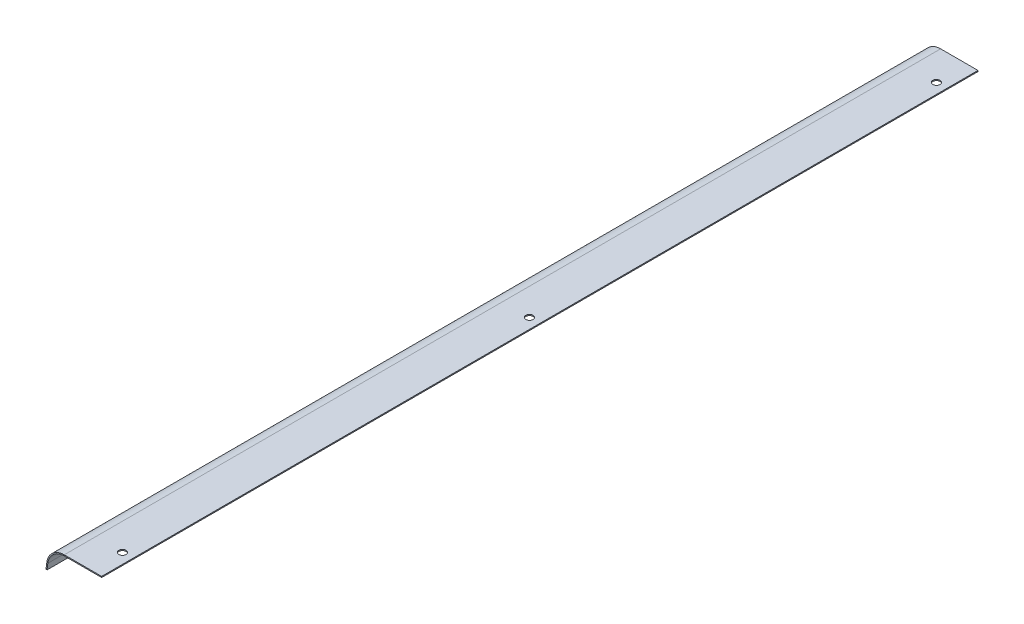
ISO-10303-21;
HEADER;
FILE_DESCRIPTION(('STEP AP214'),'2;1');
FILE_NAME('part.step','',(''),(''),'','','');
FILE_SCHEMA(('AUTOMOTIVE_DESIGN { 1 0 10303 214 1 1 1 1 }'));
ENDSEC;
DATA;
#1=APPLICATION_CONTEXT('core data for automotive mechanical design processes');
#2=APPLICATION_PROTOCOL_DEFINITION('international standard','automotive_design',2000,#1);
#3=PRODUCT_CONTEXT('',#1,'mechanical');
#4=PRODUCT('Part','Part','',(#3));
#5=PRODUCT_RELATED_PRODUCT_CATEGORY('part','',(#4));
#6=PRODUCT_DEFINITION_FORMATION('','',#4);
#7=PRODUCT_DEFINITION_CONTEXT('part definition',#1,'design');
#8=PRODUCT_DEFINITION('design','',#6,#7);
#9=PRODUCT_DEFINITION_SHAPE('','',#8);
#10=(LENGTH_UNIT() NAMED_UNIT(*) SI_UNIT(.MILLI.,.METRE.));
#11=(NAMED_UNIT(*) PLANE_ANGLE_UNIT() SI_UNIT($,.RADIAN.));
#12=(NAMED_UNIT(*) SI_UNIT($,.STERADIAN.) SOLID_ANGLE_UNIT());
#13=UNCERTAINTY_MEASURE_WITH_UNIT(LENGTH_MEASURE(1.E-05),#10,'distance_accuracy_value','');
#14=(GEOMETRIC_REPRESENTATION_CONTEXT(3) GLOBAL_UNCERTAINTY_ASSIGNED_CONTEXT((#13)) GLOBAL_UNIT_ASSIGNED_CONTEXT((#10,
#11,#12)) REPRESENTATION_CONTEXT('',''));
#15=CARTESIAN_POINT('',(0.,0.,0.));
#16=DIRECTION('',(0.,0.,1.));
#17=DIRECTION('',(1.,0.,0.));
#18=AXIS2_PLACEMENT_3D('',#15,#16,#17);
#19=CARTESIAN_POINT('',(-25.9372539331938,-7.,211.));
#20=DIRECTION('',(0.,0.,1.));
#21=DIRECTION('',(1.,0.,0.));
#22=AXIS2_PLACEMENT_3D('',#19,#20,#21);
#23=PLANE('',#22);
#24=DIRECTION('',(-0.992156741649222,0.124999999999998,0.));
#25=VECTOR('',#24,1.);
#26=CARTESIAN_POINT('',(-25.9372539331938,-7.,211.));
#27=LINE('',#26,#25);
#28=CARTESIAN_POINT('',(-25.9372539331938,-7.,211.));
#29=VERTEX_POINT('',#28);
#30=CARTESIAN_POINT('',(-26.4333323040184,-6.93750000000001,211.));
#31=VERTEX_POINT('',#30);
#32=EDGE_CURVE('E11',#29,#31,#27,.T.);
#33=ORIENTED_EDGE('',*,*,#32,.F.);
#34=CARTESIAN_POINT('',(-18.,-8.,211.));
#35=DIRECTION('',(0.,0.,1.));
#36=DIRECTION('',(1.,0.,0.));
#37=AXIS2_PLACEMENT_3D('',#34,#35,#36);
#38=CIRCLE('',#37,8.);
#39=CARTESIAN_POINT('',(-18.,0.,211.));
#40=VERTEX_POINT('',#39);
#41=EDGE_CURVE('E135',#40,#29,#38,.T.);
#42=ORIENTED_EDGE('',*,*,#41,.F.);
#43=DIRECTION('',(0.,-1.,0.));
#44=VECTOR('',#43,1.);
#45=CARTESIAN_POINT('',(-18.,0.499999999999999,211.));
#46=LINE('',#45,#44);
#47=CARTESIAN_POINT('',(-18.,0.499999999999999,211.));
#48=VERTEX_POINT('',#47);
#49=EDGE_CURVE('E46',#48,#40,#46,.T.);
#50=ORIENTED_EDGE('',*,*,#49,.F.);
#51=CARTESIAN_POINT('',(-18.,-8.,211.));
#52=DIRECTION('',(0.,0.,1.));
#53=DIRECTION('',(1.,0.,0.));
#54=AXIS2_PLACEMENT_3D('',#51,#52,#53);
#55=CIRCLE('',#54,8.5);
#56=EDGE_CURVE('E128',#48,#31,#55,.T.);
#57=ORIENTED_EDGE('',*,*,#56,.T.);
#58=EDGE_LOOP('',(#33,#42,#50,#57));
#59=FACE_BOUND('',#58,.T.);
#60=ADVANCED_FACE('F38',(#59),#23,.T.);
#61=CARTESIAN_POINT('',(-18.,0.499999999999999,211.));
#62=DIRECTION('',(0.,0.,1.));
#63=DIRECTION('',(1.,0.,0.));
#64=AXIS2_PLACEMENT_3D('',#61,#62,#63);
#65=PLANE('',#64);
#66=DIRECTION('',(-0.124999999999999,-0.992156741649222,0.));
#67=VECTOR('',#66,1.);
#68=CARTESIAN_POINT('',(-25.9372539331938,-7.,211.));
#69=LINE('',#68,#67);
#70=CARTESIAN_POINT('',(-26.3122539331938,-9.97647022494767,211.));
#71=VERTEX_POINT('',#70);
#72=EDGE_CURVE('E185',#29,#71,#69,.T.);
#73=ORIENTED_EDGE('',*,*,#72,.F.);
#74=ORIENTED_EDGE('',*,*,#32,.T.);
#75=DIRECTION('',(-0.124999999999999,-0.992156741649222,0.));
#76=VECTOR('',#75,1.);
#77=CARTESIAN_POINT('',(-26.4333323040184,-6.93750000000001,211.));
#78=LINE('',#77,#76);
#79=CARTESIAN_POINT('',(-26.8083323040184,-9.91397022494767,211.));
#80=VERTEX_POINT('',#79);
#81=EDGE_CURVE('E94',#31,#80,#78,.T.);
#82=ORIENTED_EDGE('',*,*,#81,.T.);
#83=DIRECTION('',(-0.992156741649222,0.124999999999997,0.));
#84=VECTOR('',#83,1.);
#85=CARTESIAN_POINT('',(-26.3122539331938,-9.97647022494767,211.));
#86=LINE('',#85,#84);
#87=EDGE_CURVE('E376',#71,#80,#86,.T.);
#88=ORIENTED_EDGE('',*,*,#87,.F.);
#89=EDGE_LOOP('',(#73,#74,#82,#88));
#90=FACE_BOUND('',#89,.T.);
#91=ADVANCED_FACE('F193',(#90),#65,.T.);
#92=CARTESIAN_POINT('',(-18.,0.,-211.));
#93=DIRECTION('',(0.,0.,-1.));
#94=DIRECTION('',(-1.,0.,0.));
#95=AXIS2_PLACEMENT_3D('',#92,#93,#94);
#96=PLANE('',#95);
#97=DIRECTION('',(0.,1.,0.));
#98=VECTOR('',#97,1.);
#99=CARTESIAN_POINT('',(-18.,0.,-211.));
#100=LINE('',#99,#98);
#101=CARTESIAN_POINT('',(-18.,0.,-211.));
#102=VERTEX_POINT('',#101);
#103=CARTESIAN_POINT('',(-18.,0.499999999999999,-211.));
#104=VERTEX_POINT('',#103);
#105=EDGE_CURVE('E81',#102,#104,#100,.T.);
#106=ORIENTED_EDGE('',*,*,#105,.F.);
#107=CARTESIAN_POINT('',(-18.,-8.,-211.));
#108=DIRECTION('',(0.,0.,1.));
#109=DIRECTION('',(1.,0.,0.));
#110=AXIS2_PLACEMENT_3D('',#107,#108,#109);
#111=CIRCLE('',#110,8.);
#112=CARTESIAN_POINT('',(-25.9372539331938,-7.,-211.));
#113=VERTEX_POINT('',#112);
#114=EDGE_CURVE('E151',#102,#113,#111,.T.);
#115=ORIENTED_EDGE('',*,*,#114,.T.);
#116=DIRECTION('',(0.992156741649222,-0.124999999999998,0.));
#117=VECTOR('',#116,1.);
#118=CARTESIAN_POINT('',(-26.4333323040184,-6.93750000000001,-211.));
#119=LINE('',#118,#117);
#120=CARTESIAN_POINT('',(-26.4333323040184,-6.93750000000001,-211.));
#121=VERTEX_POINT('',#120);
#122=EDGE_CURVE('E88',#121,#113,#119,.T.);
#123=ORIENTED_EDGE('',*,*,#122,.F.);
#124=CARTESIAN_POINT('',(-18.,-8.,-211.));
#125=DIRECTION('',(0.,0.,1.));
#126=DIRECTION('',(1.,0.,0.));
#127=AXIS2_PLACEMENT_3D('',#124,#125,#126);
#128=CIRCLE('',#127,8.5);
#129=EDGE_CURVE('E158',#104,#121,#128,.T.);
#130=ORIENTED_EDGE('',*,*,#129,.F.);
#131=EDGE_LOOP('',(#106,#115,#123,#130));
#132=FACE_BOUND('',#131,.T.);
#133=ADVANCED_FACE('F191',(#132),#96,.T.);
#134=CARTESIAN_POINT('',(-26.4333323040184,-6.93750000000001,-211.));
#135=DIRECTION('',(0.,0.,-1.));
#136=DIRECTION('',(-1.,0.,0.));
#137=AXIS2_PLACEMENT_3D('',#134,#135,#136);
#138=PLANE('',#137);
#139=DIRECTION('',(-1.,0.,0.));
#140=VECTOR('',#139,1.);
#141=CARTESIAN_POINT('',(0.,0.,-211.));
#142=LINE('',#141,#140);
#143=CARTESIAN_POINT('',(0.,0.,-211.));
#144=VERTEX_POINT('',#143);
#145=EDGE_CURVE('E153',#144,#102,#142,.T.);
#146=ORIENTED_EDGE('',*,*,#145,.T.);
#147=ORIENTED_EDGE('',*,*,#105,.T.);
#148=DIRECTION('',(-1.,0.,0.));
#149=VECTOR('',#148,1.);
#150=CARTESIAN_POINT('',(0.,0.5,-211.));
#151=LINE('',#150,#149);
#152=CARTESIAN_POINT('',(0.,0.5,-211.));
#153=VERTEX_POINT('',#152);
#154=EDGE_CURVE('E156',#153,#104,#151,.T.);
#155=ORIENTED_EDGE('',*,*,#154,.F.);
#156=DIRECTION('',(0.,-1.,0.));
#157=VECTOR('',#156,1.);
#158=CARTESIAN_POINT('',(0.,0.5,-211.));
#159=LINE('',#158,#157);
#160=EDGE_CURVE('E116',#153,#144,#159,.T.);
#161=ORIENTED_EDGE('',*,*,#160,.T.);
#162=EDGE_LOOP('',(#146,#147,#155,#161));
#163=FACE_BOUND('',#162,.T.);
#164=ADVANCED_FACE('F187',(#163),#138,.T.);
#165=CARTESIAN_POINT('',(-26.4333323040184,-6.93750000000001,211.));
#166=DIRECTION('',(0.992156741649222,-0.124999999999999,0.));
#167=DIRECTION('',(0.124999999999999,0.992156741649222,0.));
#168=AXIS2_PLACEMENT_3D('',#165,#166,#167);
#169=PLANE('',#168);
#170=DIRECTION('',(-0.124999999999999,-0.992156741649222,0.));
#171=VECTOR('',#170,1.);
#172=CARTESIAN_POINT('',(-26.4333323040184,-6.93750000000001,-211.));
#173=LINE('',#172,#171);
#174=CARTESIAN_POINT('',(-26.8083323040184,-9.91397022494767,-211.));
#175=VERTEX_POINT('',#174);
#176=EDGE_CURVE('E141',#121,#175,#173,.T.);
#177=ORIENTED_EDGE('',*,*,#176,.T.);
#178=DIRECTION('',(0.,0.,-1.));
#179=VECTOR('',#178,1.);
#180=CARTESIAN_POINT('',(-26.8083323040184,-9.91397022494767,211.));
#181=LINE('',#180,#179);
#182=EDGE_CURVE('E172',#80,#175,#181,.T.);
#183=ORIENTED_EDGE('',*,*,#182,.F.);
#184=ORIENTED_EDGE('',*,*,#81,.F.);
#185=DIRECTION('',(0.,0.,-1.));
#186=VECTOR('',#185,1.);
#187=CARTESIAN_POINT('',(-26.4333323040184,-6.93750000000001,211.));
#188=LINE('',#187,#186);
#189=EDGE_CURVE('E140',#31,#121,#188,.T.);
#190=ORIENTED_EDGE('',*,*,#189,.T.);
#191=EDGE_LOOP('',(#177,#183,#184,#190));
#192=FACE_BOUND('',#191,.T.);
#193=ADVANCED_FACE('F199',(#192),#169,.F.);
#194=CARTESIAN_POINT('',(-26.3122539331938,-9.97647022494767,211.));
#195=DIRECTION('',(-0.124999999999997,-0.992156741649222,0.));
#196=DIRECTION('',(0.992156741649222,-0.124999999999997,0.));
#197=AXIS2_PLACEMENT_3D('',#194,#195,#196);
#198=PLANE('',#197);
#199=DIRECTION('',(-0.992156741649222,0.124999999999997,0.));
#200=VECTOR('',#199,1.);
#201=CARTESIAN_POINT('',(-26.3122539331938,-9.97647022494767,-211.));
#202=LINE('',#201,#200);
#203=CARTESIAN_POINT('',(-26.3122539331938,-9.97647022494767,-211.));
#204=VERTEX_POINT('',#203);
#205=EDGE_CURVE('E144',#204,#175,#202,.T.);
#206=ORIENTED_EDGE('',*,*,#205,.F.);
#207=DIRECTION('',(0.,0.,-1.));
#208=VECTOR('',#207,1.);
#209=CARTESIAN_POINT('',(-26.3122539331938,-9.97647022494767,211.));
#210=LINE('',#209,#208);
#211=EDGE_CURVE('E170',#71,#204,#210,.T.);
#212=ORIENTED_EDGE('',*,*,#211,.F.);
#213=ORIENTED_EDGE('',*,*,#87,.T.);
#214=ORIENTED_EDGE('',*,*,#182,.T.);
#215=EDGE_LOOP('',(#206,#212,#213,#214));
#216=FACE_BOUND('',#215,.T.);
#217=ADVANCED_FACE('F230',(#216),#198,.T.);
#218=CARTESIAN_POINT('',(-25.9372539331938,-7.,211.));
#219=DIRECTION('',(0.992156741649222,-0.124999999999999,0.));
#220=DIRECTION('',(0.124999999999999,0.992156741649222,0.));
#221=AXIS2_PLACEMENT_3D('',#218,#219,#220);
#222=PLANE('',#221);
#223=DIRECTION('',(-0.124999999999999,-0.992156741649222,0.));
#224=VECTOR('',#223,1.);
#225=CARTESIAN_POINT('',(-25.9372539331938,-7.,-211.));
#226=LINE('',#225,#224);
#227=EDGE_CURVE('E148',#113,#204,#226,.T.);
#228=ORIENTED_EDGE('',*,*,#227,.F.);
#229=DIRECTION('',(0.,0.,-1.));
#230=VECTOR('',#229,1.);
#231=CARTESIAN_POINT('',(-25.9372539331938,-7.,211.));
#232=LINE('',#231,#230);
#233=EDGE_CURVE('E167',#29,#113,#232,.T.);
#234=ORIENTED_EDGE('',*,*,#233,.F.);
#235=ORIENTED_EDGE('',*,*,#72,.T.);
#236=ORIENTED_EDGE('',*,*,#211,.T.);
#237=EDGE_LOOP('',(#228,#234,#235,#236));
#238=FACE_BOUND('',#237,.T.);
#239=ADVANCED_FACE('F241',(#238),#222,.T.);
#240=CARTESIAN_POINT('',(-18.,-8.,211.));
#241=DIRECTION('',(0.,0.,-1.));
#242=DIRECTION('',(-1.,0.,0.));
#243=AXIS2_PLACEMENT_3D('',#240,#241,#242);
#244=CYLINDRICAL_SURFACE('',#243,8.);
#245=ORIENTED_EDGE('',*,*,#114,.F.);
#246=DIRECTION('',(0.,0.,-1.));
#247=VECTOR('',#246,1.);
#248=CARTESIAN_POINT('',(-18.,0.,211.));
#249=LINE('',#248,#247);
#250=EDGE_CURVE('E164',#40,#102,#249,.T.);
#251=ORIENTED_EDGE('',*,*,#250,.F.);
#252=ORIENTED_EDGE('',*,*,#41,.T.);
#253=ORIENTED_EDGE('',*,*,#233,.T.);
#254=EDGE_LOOP('',(#245,#251,#252,#253));
#255=FACE_BOUND('',#254,.T.);
#256=ADVANCED_FACE('F181',(#255),#244,.F.);
#257=CARTESIAN_POINT('',(0.,0.,211.));
#258=DIRECTION('',(0.,-1.,0.));
#259=DIRECTION('',(1.,0.,0.));
#260=AXIS2_PLACEMENT_3D('',#257,#258,#259);
#261=PLANE('',#260);
#262=CARTESIAN_POINT('',(-5.,0.,0.));
#263=DIRECTION('',(0.,1.,0.));
#264=DIRECTION('',(-1.,0.,0.));
#265=AXIS2_PLACEMENT_3D('',#262,#263,#264);
#266=CIRCLE('',#265,1.74999999999999);
#267=CARTESIAN_POINT('',(-6.74999999999999,0.,0.));
#268=VERTEX_POINT('',#267);
#269=EDGE_CURVE('E357',#268,#268,#266,.T.);
#270=ORIENTED_EDGE('',*,*,#269,.T.);
#271=EDGE_LOOP('',(#270));
#272=FACE_BOUND('',#271,.T.);
#273=CARTESIAN_POINT('',(-5.,0.,-196.));
#274=DIRECTION('',(0.,1.,0.));
#275=DIRECTION('',(1.,0.,0.));
#276=AXIS2_PLACEMENT_3D('',#273,#274,#275);
#277=CIRCLE('',#276,1.74999999999999);
#278=CARTESIAN_POINT('',(-3.25000000000001,0.,-196.));
#279=VERTEX_POINT('',#278);
#280=EDGE_CURVE('E365',#279,#279,#277,.T.);
#281=ORIENTED_EDGE('',*,*,#280,.T.);
#282=EDGE_LOOP('',(#281));
#283=FACE_BOUND('',#282,.T.);
#284=CARTESIAN_POINT('',(-5.,0.,196.));
#285=DIRECTION('',(0.,1.,0.));
#286=DIRECTION('',(-1.,0.,0.));
#287=AXIS2_PLACEMENT_3D('',#284,#285,#286);
#288=CIRCLE('',#287,1.74999999999999);
#289=CARTESIAN_POINT('',(-6.74999999999999,0.,196.));
#290=VERTEX_POINT('',#289);
#291=EDGE_CURVE('E145',#290,#290,#288,.T.);
#292=ORIENTED_EDGE('',*,*,#291,.T.);
#293=EDGE_LOOP('',(#292));
#294=FACE_BOUND('',#293,.T.);
#295=ORIENTED_EDGE('',*,*,#145,.F.);
#296=DIRECTION('',(0.,0.,-1.));
#297=VECTOR('',#296,1.);
#298=CARTESIAN_POINT('',(0.,0.,211.));
#299=LINE('',#298,#297);
#300=CARTESIAN_POINT('',(0.,0.,211.));
#301=VERTEX_POINT('',#300);
#302=EDGE_CURVE('E118',#301,#144,#299,.T.);
#303=ORIENTED_EDGE('',*,*,#302,.F.);
#304=DIRECTION('',(-1.,0.,0.));
#305=VECTOR('',#304,1.);
#306=CARTESIAN_POINT('',(0.,0.,211.));
#307=LINE('',#306,#305);
#308=EDGE_CURVE('E133',#301,#40,#307,.T.);
#309=ORIENTED_EDGE('',*,*,#308,.T.);
#310=ORIENTED_EDGE('',*,*,#250,.T.);
#311=EDGE_LOOP('',(#295,#303,#309,#310));
#312=FACE_BOUND('',#311,.T.);
#313=ADVANCED_FACE('F186',(#272,#283,#294,#312),#261,.T.);
#314=CARTESIAN_POINT('',(0.,0.5,211.));
#315=DIRECTION('',(1.,0.,0.));
#316=DIRECTION('',(0.,1.,0.));
#317=AXIS2_PLACEMENT_3D('',#314,#315,#316);
#318=PLANE('',#317);
#319=ORIENTED_EDGE('',*,*,#160,.F.);
#320=DIRECTION('',(0.,0.,-1.));
#321=VECTOR('',#320,1.);
#322=CARTESIAN_POINT('',(0.,0.5,211.));
#323=LINE('',#322,#321);
#324=CARTESIAN_POINT('',(0.,0.5,211.));
#325=VERTEX_POINT('',#324);
#326=EDGE_CURVE('E110',#325,#153,#323,.T.);
#327=ORIENTED_EDGE('',*,*,#326,.F.);
#328=DIRECTION('',(0.,-1.,0.));
#329=VECTOR('',#328,1.);
#330=CARTESIAN_POINT('',(0.,0.5,211.));
#331=LINE('',#330,#329);
#332=EDGE_CURVE('E114',#325,#301,#331,.T.);
#333=ORIENTED_EDGE('',*,*,#332,.T.);
#334=ORIENTED_EDGE('',*,*,#302,.T.);
#335=EDGE_LOOP('',(#319,#327,#333,#334));
#336=FACE_BOUND('',#335,.T.);
#337=ADVANCED_FACE('F112',(#336),#318,.T.);
#338=CARTESIAN_POINT('',(0.,0.5,211.));
#339=DIRECTION('',(0.,-1.,0.));
#340=DIRECTION('',(1.,0.,0.));
#341=AXIS2_PLACEMENT_3D('',#338,#339,#340);
#342=PLANE('',#341);
#343=CARTESIAN_POINT('',(-5.,0.499999999999999,0.));
#344=DIRECTION('',(0.,1.,0.));
#345=DIRECTION('',(-1.,0.,0.));
#346=AXIS2_PLACEMENT_3D('',#343,#344,#345);
#347=CIRCLE('',#346,1.74999999999999);
#348=CARTESIAN_POINT('',(-6.74999999999999,0.499999999999999,0.));
#349=VERTEX_POINT('',#348);
#350=EDGE_CURVE('E360',#349,#349,#347,.T.);
#351=ORIENTED_EDGE('',*,*,#350,.F.);
#352=EDGE_LOOP('',(#351));
#353=FACE_BOUND('',#352,.T.);
#354=CARTESIAN_POINT('',(-5.,0.499999999999999,-196.));
#355=DIRECTION('',(0.,1.,0.));
#356=DIRECTION('',(1.,0.,0.));
#357=AXIS2_PLACEMENT_3D('',#354,#355,#356);
#358=CIRCLE('',#357,1.74999999999999);
#359=CARTESIAN_POINT('',(-3.25000000000001,0.5,-196.));
#360=VERTEX_POINT('',#359);
#361=EDGE_CURVE('E362',#360,#360,#358,.T.);
#362=ORIENTED_EDGE('',*,*,#361,.F.);
#363=EDGE_LOOP('',(#362));
#364=FACE_BOUND('',#363,.T.);
#365=CARTESIAN_POINT('',(-5.,0.499999999999999,196.));
#366=DIRECTION('',(0.,1.,0.));
#367=DIRECTION('',(-1.,0.,0.));
#368=AXIS2_PLACEMENT_3D('',#365,#366,#367);
#369=CIRCLE('',#368,1.74999999999999);
#370=CARTESIAN_POINT('',(-6.74999999999999,0.499999999999999,196.));
#371=VERTEX_POINT('',#370);
#372=EDGE_CURVE('E368',#371,#371,#369,.T.);
#373=ORIENTED_EDGE('',*,*,#372,.F.);
#374=EDGE_LOOP('',(#373));
#375=FACE_BOUND('',#374,.T.);
#376=ORIENTED_EDGE('',*,*,#154,.T.);
#377=DIRECTION('',(0.,0.,-1.));
#378=VECTOR('',#377,1.);
#379=CARTESIAN_POINT('',(-18.,0.499999999999999,211.));
#380=LINE('',#379,#378);
#381=EDGE_CURVE('E119',#48,#104,#380,.T.);
#382=ORIENTED_EDGE('',*,*,#381,.F.);
#383=DIRECTION('',(-1.,0.,0.));
#384=VECTOR('',#383,1.);
#385=CARTESIAN_POINT('',(0.,0.5,211.));
#386=LINE('',#385,#384);
#387=EDGE_CURVE('E123',#325,#48,#386,.T.);
#388=ORIENTED_EDGE('',*,*,#387,.F.);
#389=ORIENTED_EDGE('',*,*,#326,.T.);
#390=EDGE_LOOP('',(#376,#382,#388,#389));
#391=FACE_BOUND('',#390,.T.);
#392=ADVANCED_FACE('F124',(#353,#364,#375,#391),#342,.F.);
#393=CARTESIAN_POINT('',(-18.,-8.,211.));
#394=DIRECTION('',(0.,0.,-1.));
#395=DIRECTION('',(-1.,0.,0.));
#396=AXIS2_PLACEMENT_3D('',#393,#394,#395);
#397=CYLINDRICAL_SURFACE('',#396,8.5);
#398=ORIENTED_EDGE('',*,*,#129,.T.);
#399=ORIENTED_EDGE('',*,*,#189,.F.);
#400=ORIENTED_EDGE('',*,*,#56,.F.);
#401=ORIENTED_EDGE('',*,*,#381,.T.);
#402=EDGE_LOOP('',(#398,#399,#400,#401));
#403=FACE_BOUND('',#402,.T.);
#404=ADVANCED_FACE('F189',(#403),#397,.T.);
#405=CARTESIAN_POINT('',(-18.,-8.,211.));
#406=DIRECTION('',(0.,0.,1.));
#407=DIRECTION('',(1.,0.,0.));
#408=AXIS2_PLACEMENT_3D('',#405,#406,#407);
#409=PLANE('',#408);
#410=ORIENTED_EDGE('',*,*,#387,.T.);
#411=ORIENTED_EDGE('',*,*,#49,.T.);
#412=ORIENTED_EDGE('',*,*,#308,.F.);
#413=ORIENTED_EDGE('',*,*,#332,.F.);
#414=EDGE_LOOP('',(#410,#411,#412,#413));
#415=FACE_BOUND('',#414,.T.);
#416=ADVANCED_FACE('F131',(#415),#409,.T.);
#417=CARTESIAN_POINT('',(-18.,-8.,-211.));
#418=DIRECTION('',(0.,0.,1.));
#419=DIRECTION('',(1.,0.,0.));
#420=AXIS2_PLACEMENT_3D('',#417,#418,#419);
#421=PLANE('',#420);
#422=ORIENTED_EDGE('',*,*,#176,.F.);
#423=ORIENTED_EDGE('',*,*,#122,.T.);
#424=ORIENTED_EDGE('',*,*,#227,.T.);
#425=ORIENTED_EDGE('',*,*,#205,.T.);
#426=EDGE_LOOP('',(#422,#423,#424,#425));
#427=FACE_BOUND('',#426,.T.);
#428=ADVANCED_FACE('F293',(#427),#421,.F.);
#429=CARTESIAN_POINT('',(-5.,0.,196.));
#430=DIRECTION('',(0.,1.,0.));
#431=DIRECTION('',(-1.,0.,0.));
#432=AXIS2_PLACEMENT_3D('',#429,#430,#431);
#433=CYLINDRICAL_SURFACE('',#432,1.74999999999999);
#434=ORIENTED_EDGE('',*,*,#291,.F.);
#435=EDGE_LOOP('',(#434));
#436=FACE_BOUND('',#435,.T.);
#437=ORIENTED_EDGE('',*,*,#372,.T.);
#438=EDGE_LOOP('',(#437));
#439=FACE_BOUND('',#438,.T.);
#440=ADVANCED_FACE('F303',(#436,#439),#433,.F.);
#441=CARTESIAN_POINT('',(-5.,0.,-196.));
#442=DIRECTION('',(0.,1.,0.));
#443=DIRECTION('',(-1.,0.,0.));
#444=AXIS2_PLACEMENT_3D('',#441,#442,#443);
#445=CYLINDRICAL_SURFACE('',#444,1.74999999999999);
#446=ORIENTED_EDGE('',*,*,#280,.F.);
#447=EDGE_LOOP('',(#446));
#448=FACE_BOUND('',#447,.T.);
#449=ORIENTED_EDGE('',*,*,#361,.T.);
#450=EDGE_LOOP('',(#449));
#451=FACE_BOUND('',#450,.T.);
#452=ADVANCED_FACE('F330',(#448,#451),#445,.F.);
#453=CARTESIAN_POINT('',(-5.,0.,0.));
#454=DIRECTION('',(0.,1.,0.));
#455=DIRECTION('',(-1.,0.,0.));
#456=AXIS2_PLACEMENT_3D('',#453,#454,#455);
#457=CYLINDRICAL_SURFACE('',#456,1.74999999999999);
#458=ORIENTED_EDGE('',*,*,#269,.F.);
#459=EDGE_LOOP('',(#458));
#460=FACE_BOUND('',#459,.T.);
#461=ORIENTED_EDGE('',*,*,#350,.T.);
#462=EDGE_LOOP('',(#461));
#463=FACE_BOUND('',#462,.T.);
#464=ADVANCED_FACE('F340',(#460,#463),#457,.F.);
#465=CLOSED_SHELL('',(#60,#91,#133,#164,#193,#217,#239,#256,#313,#337,#392,#404,#416,#428,#440,
#452,#464));
#466=MANIFOLD_SOLID_BREP('B2',#465);
#467=ADVANCED_BREP_SHAPE_REPRESENTATION('',(#18,#466),#14);
#468=SHAPE_DEFINITION_REPRESENTATION(#9,#467);
ENDSEC;
END-ISO-10303-21;
